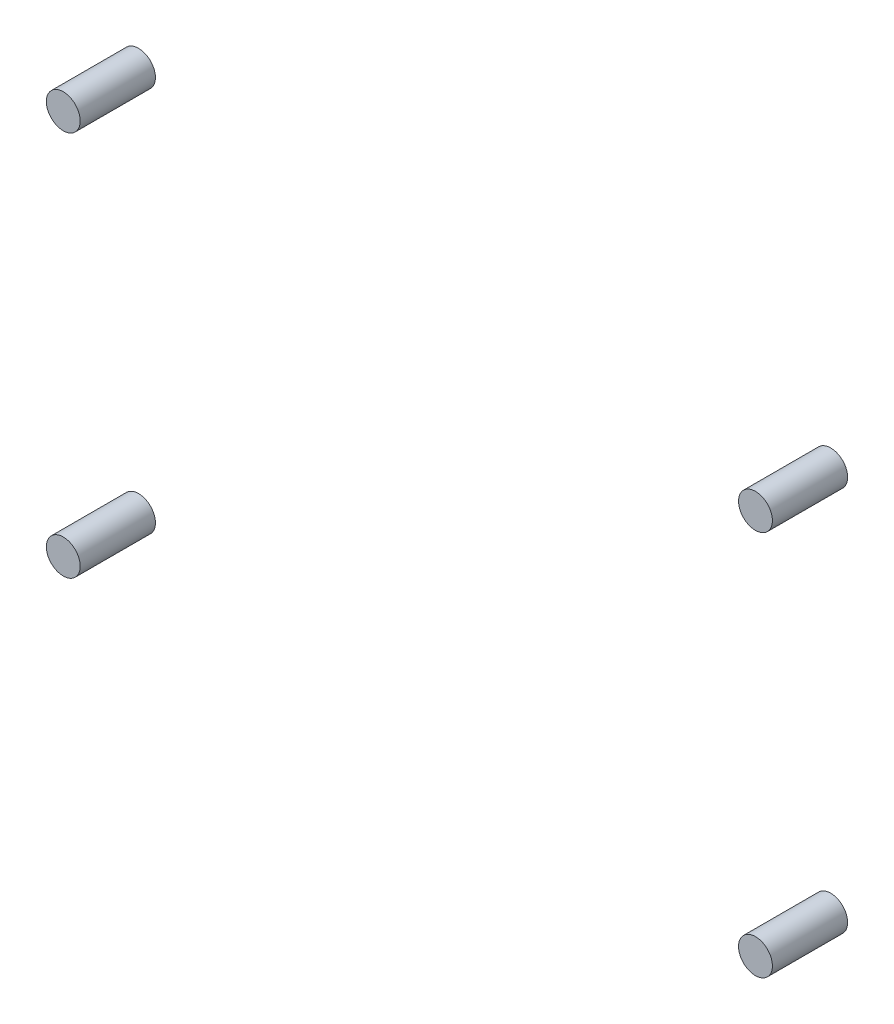
ISO-10303-21;
HEADER;
FILE_DESCRIPTION(('STEP AP214'),'2;1');
FILE_NAME('part.step','',(''),(''),'','','');
FILE_SCHEMA(('AUTOMOTIVE_DESIGN { 1 0 10303 214 1 1 1 1 }'));
ENDSEC;
DATA;
#1=APPLICATION_CONTEXT('core data for automotive mechanical design processes');
#2=APPLICATION_PROTOCOL_DEFINITION('international standard','automotive_design',2000,#1);
#3=PRODUCT_CONTEXT('',#1,'mechanical');
#4=PRODUCT('Part','Part','',(#3));
#5=PRODUCT_RELATED_PRODUCT_CATEGORY('part','',(#4));
#6=PRODUCT_DEFINITION_FORMATION('','',#4);
#7=PRODUCT_DEFINITION_CONTEXT('part definition',#1,'design');
#8=PRODUCT_DEFINITION('design','',#6,#7);
#9=PRODUCT_DEFINITION_SHAPE('','',#8);
#10=(LENGTH_UNIT() NAMED_UNIT(*) SI_UNIT(.MILLI.,.METRE.));
#11=(NAMED_UNIT(*) PLANE_ANGLE_UNIT() SI_UNIT($,.RADIAN.));
#12=(NAMED_UNIT(*) SI_UNIT($,.STERADIAN.) SOLID_ANGLE_UNIT());
#13=UNCERTAINTY_MEASURE_WITH_UNIT(LENGTH_MEASURE(1.E-05),#10,'distance_accuracy_value','');
#14=(GEOMETRIC_REPRESENTATION_CONTEXT(3) GLOBAL_UNCERTAINTY_ASSIGNED_CONTEXT((#13)) GLOBAL_UNIT_ASSIGNED_CONTEXT((#10,
#11,#12)) REPRESENTATION_CONTEXT('',''));
#15=CARTESIAN_POINT('',(0.,0.,0.));
#16=DIRECTION('',(0.,0.,1.));
#17=DIRECTION('',(1.,0.,0.));
#18=AXIS2_PLACEMENT_3D('',#15,#16,#17);
#19=CARTESIAN_POINT('',(-28.5,-10.25,-39.45));
#20=DIRECTION('',(0.,0.,1.));
#21=DIRECTION('',(1.,0.,0.));
#22=AXIS2_PLACEMENT_3D('',#19,#20,#21);
#23=PLANE('',#22);
#24=CARTESIAN_POINT('',(-28.5,-10.25,-39.45));
#25=DIRECTION('',(0.,0.,1.));
#26=DIRECTION('',(1.,0.,0.));
#27=AXIS2_PLACEMENT_3D('',#24,#25,#26);
#28=CIRCLE('',#27,0.9);
#29=CARTESIAN_POINT('',(-27.6,-10.25,-39.45));
#30=VERTEX_POINT('',#29);
#31=EDGE_CURVE('P0_E10',#30,#30,#28,.T.);
#32=ORIENTED_EDGE('',*,*,#31,.F.);
#33=EDGE_LOOP('',(#32));
#34=FACE_BOUND('',#33,.T.);
#35=ADVANCED_FACE('P0_F15',(#34),#23,.F.);
#36=CARTESIAN_POINT('',(-28.5,-10.25,-35.45));
#37=DIRECTION('',(0.,0.,1.));
#38=DIRECTION('',(1.,0.,0.));
#39=AXIS2_PLACEMENT_3D('',#36,#37,#38);
#40=PLANE('',#39);
#41=CARTESIAN_POINT('',(-28.5,-10.25,-35.45));
#42=DIRECTION('',(0.,0.,1.));
#43=DIRECTION('',(1.,0.,0.));
#44=AXIS2_PLACEMENT_3D('',#41,#42,#43);
#45=CIRCLE('',#44,0.9);
#46=CARTESIAN_POINT('',(-27.6,-10.25,-35.45));
#47=VERTEX_POINT('',#46);
#48=EDGE_CURVE('P0_E22',#47,#47,#45,.T.);
#49=ORIENTED_EDGE('',*,*,#48,.T.);
#50=EDGE_LOOP('',(#49));
#51=FACE_BOUND('',#50,.T.);
#52=ADVANCED_FACE('P0_F35',(#51),#40,.T.);
#53=CARTESIAN_POINT('',(-28.5,-10.25,-39.45));
#54=DIRECTION('',(0.,0.,1.));
#55=DIRECTION('',(1.,0.,0.));
#56=AXIS2_PLACEMENT_3D('',#53,#54,#55);
#57=CYLINDRICAL_SURFACE('',#56,0.9);
#58=ORIENTED_EDGE('',*,*,#48,.F.);
#59=EDGE_LOOP('',(#58));
#60=FACE_BOUND('',#59,.T.);
#61=ORIENTED_EDGE('',*,*,#31,.T.);
#62=EDGE_LOOP('',(#61));
#63=FACE_BOUND('',#62,.T.);
#64=ADVANCED_FACE('P0_F37',(#60,#63),#57,.T.);
#65=CLOSED_SHELL('',(#35,#52,#64));
#66=MANIFOLD_SOLID_BREP('P0_B1',#65);
#67=CARTESIAN_POINT('',(-28.5,10.25,-39.45));
#68=DIRECTION('',(0.,0.,1.));
#69=DIRECTION('',(1.,0.,0.));
#70=AXIS2_PLACEMENT_3D('',#67,#68,#69);
#71=PLANE('',#70);
#72=CARTESIAN_POINT('',(-28.5,10.25,-39.45));
#73=DIRECTION('',(0.,0.,1.));
#74=DIRECTION('',(1.,0.,0.));
#75=AXIS2_PLACEMENT_3D('',#72,#73,#74);
#76=CIRCLE('',#75,0.9);
#77=CARTESIAN_POINT('',(-27.6,10.25,-39.45));
#78=VERTEX_POINT('',#77);
#79=EDGE_CURVE('P1_E10',#78,#78,#76,.T.);
#80=ORIENTED_EDGE('',*,*,#79,.F.);
#81=EDGE_LOOP('',(#80));
#82=FACE_BOUND('',#81,.T.);
#83=ADVANCED_FACE('P1_F15',(#82),#71,.F.);
#84=CARTESIAN_POINT('',(-28.5,10.25,-35.45));
#85=DIRECTION('',(0.,0.,1.));
#86=DIRECTION('',(1.,0.,0.));
#87=AXIS2_PLACEMENT_3D('',#84,#85,#86);
#88=PLANE('',#87);
#89=CARTESIAN_POINT('',(-28.5,10.25,-35.45));
#90=DIRECTION('',(0.,0.,1.));
#91=DIRECTION('',(1.,0.,0.));
#92=AXIS2_PLACEMENT_3D('',#89,#90,#91);
#93=CIRCLE('',#92,0.9);
#94=CARTESIAN_POINT('',(-27.6,10.25,-35.45));
#95=VERTEX_POINT('',#94);
#96=EDGE_CURVE('P1_E22',#95,#95,#93,.T.);
#97=ORIENTED_EDGE('',*,*,#96,.T.);
#98=EDGE_LOOP('',(#97));
#99=FACE_BOUND('',#98,.T.);
#100=ADVANCED_FACE('P1_F35',(#99),#88,.T.);
#101=CARTESIAN_POINT('',(-28.5,10.25,-39.45));
#102=DIRECTION('',(0.,0.,1.));
#103=DIRECTION('',(1.,0.,0.));
#104=AXIS2_PLACEMENT_3D('',#101,#102,#103);
#105=CYLINDRICAL_SURFACE('',#104,0.9);
#106=ORIENTED_EDGE('',*,*,#96,.F.);
#107=EDGE_LOOP('',(#106));
#108=FACE_BOUND('',#107,.T.);
#109=ORIENTED_EDGE('',*,*,#79,.T.);
#110=EDGE_LOOP('',(#109));
#111=FACE_BOUND('',#110,.T.);
#112=ADVANCED_FACE('P1_F37',(#108,#111),#105,.T.);
#113=CLOSED_SHELL('',(#83,#100,#112));
#114=MANIFOLD_SOLID_BREP('P1_B1',#113);
#115=CARTESIAN_POINT('',(8.3,-10.25,-39.45));
#116=DIRECTION('',(0.,0.,1.));
#117=DIRECTION('',(1.,0.,0.));
#118=AXIS2_PLACEMENT_3D('',#115,#116,#117);
#119=PLANE('',#118);
#120=CARTESIAN_POINT('',(8.3,-10.25,-39.45));
#121=DIRECTION('',(0.,0.,1.));
#122=DIRECTION('',(1.,0.,0.));
#123=AXIS2_PLACEMENT_3D('',#120,#121,#122);
#124=CIRCLE('',#123,0.9);
#125=CARTESIAN_POINT('',(9.2,-10.25,-39.45));
#126=VERTEX_POINT('',#125);
#127=EDGE_CURVE('P2_E10',#126,#126,#124,.T.);
#128=ORIENTED_EDGE('',*,*,#127,.F.);
#129=EDGE_LOOP('',(#128));
#130=FACE_BOUND('',#129,.T.);
#131=ADVANCED_FACE('P2_F15',(#130),#119,.F.);
#132=CARTESIAN_POINT('',(8.3,-10.25,-35.45));
#133=DIRECTION('',(0.,0.,1.));
#134=DIRECTION('',(1.,0.,0.));
#135=AXIS2_PLACEMENT_3D('',#132,#133,#134);
#136=PLANE('',#135);
#137=CARTESIAN_POINT('',(8.3,-10.25,-35.45));
#138=DIRECTION('',(0.,0.,1.));
#139=DIRECTION('',(1.,0.,0.));
#140=AXIS2_PLACEMENT_3D('',#137,#138,#139);
#141=CIRCLE('',#140,0.9);
#142=CARTESIAN_POINT('',(9.2,-10.25,-35.45));
#143=VERTEX_POINT('',#142);
#144=EDGE_CURVE('P2_E22',#143,#143,#141,.T.);
#145=ORIENTED_EDGE('',*,*,#144,.T.);
#146=EDGE_LOOP('',(#145));
#147=FACE_BOUND('',#146,.T.);
#148=ADVANCED_FACE('P2_F35',(#147),#136,.T.);
#149=CARTESIAN_POINT('',(8.3,-10.25,-39.45));
#150=DIRECTION('',(0.,0.,1.));
#151=DIRECTION('',(1.,0.,0.));
#152=AXIS2_PLACEMENT_3D('',#149,#150,#151);
#153=CYLINDRICAL_SURFACE('',#152,0.9);
#154=ORIENTED_EDGE('',*,*,#144,.F.);
#155=EDGE_LOOP('',(#154));
#156=FACE_BOUND('',#155,.T.);
#157=ORIENTED_EDGE('',*,*,#127,.T.);
#158=EDGE_LOOP('',(#157));
#159=FACE_BOUND('',#158,.T.);
#160=ADVANCED_FACE('P2_F37',(#156,#159),#153,.T.);
#161=CLOSED_SHELL('',(#131,#148,#160));
#162=MANIFOLD_SOLID_BREP('P2_B1',#161);
#163=CARTESIAN_POINT('',(8.3,10.25,-39.45));
#164=DIRECTION('',(0.,0.,1.));
#165=DIRECTION('',(1.,0.,0.));
#166=AXIS2_PLACEMENT_3D('',#163,#164,#165);
#167=PLANE('',#166);
#168=CARTESIAN_POINT('',(8.3,10.25,-39.45));
#169=DIRECTION('',(0.,0.,1.));
#170=DIRECTION('',(1.,0.,0.));
#171=AXIS2_PLACEMENT_3D('',#168,#169,#170);
#172=CIRCLE('',#171,0.9);
#173=CARTESIAN_POINT('',(9.2,10.25,-39.45));
#174=VERTEX_POINT('',#173);
#175=EDGE_CURVE('P3_E9',#174,#174,#172,.T.);
#176=ORIENTED_EDGE('',*,*,#175,.F.);
#177=EDGE_LOOP('',(#176));
#178=FACE_BOUND('',#177,.T.);
#179=ADVANCED_FACE('P3_F14',(#178),#167,.F.);
#180=CARTESIAN_POINT('',(8.3,10.25,-35.45));
#181=DIRECTION('',(0.,0.,1.));
#182=DIRECTION('',(1.,0.,0.));
#183=AXIS2_PLACEMENT_3D('',#180,#181,#182);
#184=PLANE('',#183);
#185=CARTESIAN_POINT('',(8.3,10.25,-35.45));
#186=DIRECTION('',(0.,0.,1.));
#187=DIRECTION('',(1.,0.,0.));
#188=AXIS2_PLACEMENT_3D('',#185,#186,#187);
#189=CIRCLE('',#188,0.9);
#190=CARTESIAN_POINT('',(9.2,10.25,-35.45));
#191=VERTEX_POINT('',#190);
#192=EDGE_CURVE('P3_E22',#191,#191,#189,.T.);
#193=ORIENTED_EDGE('',*,*,#192,.T.);
#194=EDGE_LOOP('',(#193));
#195=FACE_BOUND('',#194,.T.);
#196=ADVANCED_FACE('P3_F16',(#195),#184,.T.);
#197=CARTESIAN_POINT('',(8.3,10.25,-39.45));
#198=DIRECTION('',(0.,0.,1.));
#199=DIRECTION('',(1.,0.,0.));
#200=AXIS2_PLACEMENT_3D('',#197,#198,#199);
#201=CYLINDRICAL_SURFACE('',#200,0.9);
#202=ORIENTED_EDGE('',*,*,#192,.F.);
#203=EDGE_LOOP('',(#202));
#204=FACE_BOUND('',#203,.T.);
#205=ORIENTED_EDGE('',*,*,#175,.T.);
#206=EDGE_LOOP('',(#205));
#207=FACE_BOUND('',#206,.T.);
#208=ADVANCED_FACE('P3_F36',(#204,#207),#201,.T.);
#209=CLOSED_SHELL('',(#179,#196,#208));
#210=MANIFOLD_SOLID_BREP('P3_B1',#209);
#211=ADVANCED_BREP_SHAPE_REPRESENTATION('',(#18,#66,#114,#162,#210),#14);
#212=SHAPE_DEFINITION_REPRESENTATION(#9,#211);
ENDSEC;
END-ISO-10303-21;
